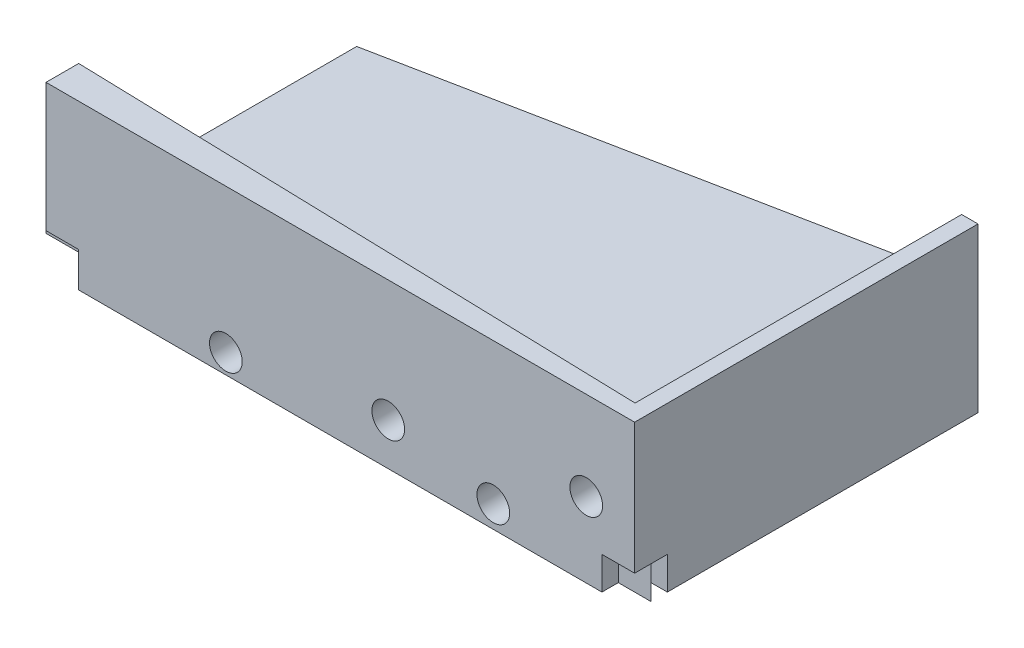
ISO-10303-21;
HEADER;
FILE_DESCRIPTION(('STEP AP214'),'2;1');
FILE_NAME('part.step','',(''),(''),'','','');
FILE_SCHEMA(('AUTOMOTIVE_DESIGN { 1 0 10303 214 1 1 1 1 }'));
ENDSEC;
DATA;
#1=APPLICATION_CONTEXT('core data for automotive mechanical design processes');
#2=APPLICATION_PROTOCOL_DEFINITION('international standard','automotive_design',2000,#1);
#3=PRODUCT_CONTEXT('',#1,'mechanical');
#4=PRODUCT('Part','Part','',(#3));
#5=PRODUCT_RELATED_PRODUCT_CATEGORY('part','',(#4));
#6=PRODUCT_DEFINITION_FORMATION('','',#4);
#7=PRODUCT_DEFINITION_CONTEXT('part definition',#1,'design');
#8=PRODUCT_DEFINITION('design','',#6,#7);
#9=PRODUCT_DEFINITION_SHAPE('','',#8);
#10=(LENGTH_UNIT() NAMED_UNIT(*) SI_UNIT(.MILLI.,.METRE.));
#11=(NAMED_UNIT(*) PLANE_ANGLE_UNIT() SI_UNIT($,.RADIAN.));
#12=(NAMED_UNIT(*) SI_UNIT($,.STERADIAN.) SOLID_ANGLE_UNIT());
#13=UNCERTAINTY_MEASURE_WITH_UNIT(LENGTH_MEASURE(1.E-05),#10,'distance_accuracy_value','');
#14=(GEOMETRIC_REPRESENTATION_CONTEXT(3) GLOBAL_UNCERTAINTY_ASSIGNED_CONTEXT((#13)) GLOBAL_UNIT_ASSIGNED_CONTEXT((#10,
#11,#12)) REPRESENTATION_CONTEXT('',''));
#15=CARTESIAN_POINT('',(0.,0.,0.));
#16=DIRECTION('',(0.,0.,1.));
#17=DIRECTION('',(1.,0.,0.));
#18=AXIS2_PLACEMENT_3D('',#15,#16,#17);
#19=CARTESIAN_POINT('',(-40.7960134047091,6.,200.));
#20=DIRECTION('',(0.,0.,-1.));
#21=DIRECTION('',(-1.,0.,0.));
#22=AXIS2_PLACEMENT_3D('',#19,#20,#21);
#23=CYLINDRICAL_SURFACE('',#22,3.);
#24=CARTESIAN_POINT('',(-40.7960134047091,6.,100.));
#25=DIRECTION('',(0.,0.,1.));
#26=DIRECTION('',(1.,0.,0.));
#27=AXIS2_PLACEMENT_3D('',#24,#25,#26);
#28=CIRCLE('',#27,3.);
#29=CARTESIAN_POINT('',(-37.7960134047091,6.,100.));
#30=VERTEX_POINT('',#29);
#31=EDGE_CURVE('E182',#30,#30,#28,.T.);
#32=ORIENTED_EDGE('',*,*,#31,.F.);
#33=EDGE_LOOP('',(#32));
#34=FACE_BOUND('',#33,.T.);
#35=CARTESIAN_POINT('',(-40.7960134047091,6.,190.));
#36=DIRECTION('',(0.,0.,1.));
#37=DIRECTION('',(1.,0.,0.));
#38=AXIS2_PLACEMENT_3D('',#35,#36,#37);
#39=CIRCLE('',#38,3.);
#40=CARTESIAN_POINT('',(-37.7960134047091,6.,190.));
#41=VERTEX_POINT('',#40);
#42=EDGE_CURVE('E184',#41,#41,#39,.T.);
#43=ORIENTED_EDGE('',*,*,#42,.T.);
#44=EDGE_LOOP('',(#43));
#45=FACE_BOUND('',#44,.T.);
#46=ADVANCED_FACE('F35',(#34,#45),#23,.F.);
#47=CARTESIAN_POINT('',(8.86154286614935,12.9010851063287,200.));
#48=DIRECTION('',(0.,0.,-1.));
#49=DIRECTION('',(-1.,0.,0.));
#50=AXIS2_PLACEMENT_3D('',#47,#48,#49);
#51=CYLINDRICAL_SURFACE('',#50,3.);
#52=CARTESIAN_POINT('',(8.86154286614935,12.9010851063287,100.));
#53=DIRECTION('',(0.,0.,1.));
#54=DIRECTION('',(1.,0.,0.));
#55=AXIS2_PLACEMENT_3D('',#52,#53,#54);
#56=CIRCLE('',#55,3.);
#57=CARTESIAN_POINT('',(11.8615428661494,12.9010851063287,100.));
#58=VERTEX_POINT('',#57);
#59=EDGE_CURVE('E418',#58,#58,#56,.T.);
#60=ORIENTED_EDGE('',*,*,#59,.F.);
#61=EDGE_LOOP('',(#60));
#62=FACE_BOUND('',#61,.T.);
#63=CARTESIAN_POINT('',(8.86154286614935,12.9010851063287,190.));
#64=DIRECTION('',(0.,0.,1.));
#65=DIRECTION('',(1.,0.,0.));
#66=AXIS2_PLACEMENT_3D('',#63,#64,#65);
#67=CIRCLE('',#66,3.);
#68=CARTESIAN_POINT('',(11.8615428661494,12.9010851063287,190.));
#69=VERTEX_POINT('',#68);
#70=EDGE_CURVE('E189',#69,#69,#67,.T.);
#71=ORIENTED_EDGE('',*,*,#70,.T.);
#72=EDGE_LOOP('',(#71));
#73=FACE_BOUND('',#72,.T.);
#74=ADVANCED_FACE('F365',(#62,#73),#51,.F.);
#75=CARTESIAN_POINT('',(40.9814690667464,6.77616521020496,200.));
#76=DIRECTION('',(0.,0.,-1.));
#77=DIRECTION('',(-1.,0.,0.));
#78=AXIS2_PLACEMENT_3D('',#75,#76,#77);
#79=CYLINDRICAL_SURFACE('',#78,3.00000000000001);
#80=CARTESIAN_POINT('',(40.9814690667464,6.77616521020496,100.));
#81=DIRECTION('',(0.,0.,1.));
#82=DIRECTION('',(1.,0.,0.));
#83=AXIS2_PLACEMENT_3D('',#80,#81,#82);
#84=CIRCLE('',#83,3.00000000000001);
#85=CARTESIAN_POINT('',(43.9814690667464,6.77616521020496,100.));
#86=VERTEX_POINT('',#85);
#87=EDGE_CURVE('E411',#86,#86,#84,.T.);
#88=ORIENTED_EDGE('',*,*,#87,.F.);
#89=EDGE_LOOP('',(#88));
#90=FACE_BOUND('',#89,.T.);
#91=CARTESIAN_POINT('',(40.9814690667464,6.77616521020496,190.));
#92=DIRECTION('',(0.,0.,1.));
#93=DIRECTION('',(1.,0.,0.));
#94=AXIS2_PLACEMENT_3D('',#91,#92,#93);
#95=CIRCLE('',#94,3.00000000000001);
#96=CARTESIAN_POINT('',(43.9814690667464,6.77616521020496,190.));
#97=VERTEX_POINT('',#96);
#98=EDGE_CURVE('E196',#97,#97,#95,.T.);
#99=ORIENTED_EDGE('',*,*,#98,.T.);
#100=EDGE_LOOP('',(#99));
#101=FACE_BOUND('',#100,.T.);
#102=ADVANCED_FACE('F371',(#90,#101),#79,.F.);
#103=CARTESIAN_POINT('',(69.4060048708337,22.9393971638675,200.));
#104=DIRECTION('',(0.,0.,-1.));
#105=DIRECTION('',(-1.,0.,0.));
#106=AXIS2_PLACEMENT_3D('',#103,#104,#105);
#107=CYLINDRICAL_SURFACE('',#106,3.00000000000001);
#108=CARTESIAN_POINT('',(69.4060048708337,22.9393971638675,100.));
#109=DIRECTION('',(0.,0.,1.));
#110=DIRECTION('',(1.,0.,0.));
#111=AXIS2_PLACEMENT_3D('',#108,#109,#110);
#112=CIRCLE('',#111,3.00000000000001);
#113=CARTESIAN_POINT('',(72.4060048708337,22.9393971638675,100.));
#114=VERTEX_POINT('',#113);
#115=EDGE_CURVE('E408',#114,#114,#112,.T.);
#116=ORIENTED_EDGE('',*,*,#115,.F.);
#117=EDGE_LOOP('',(#116));
#118=FACE_BOUND('',#117,.T.);
#119=CARTESIAN_POINT('',(69.4060048708337,22.9393971638675,190.));
#120=DIRECTION('',(0.,0.,1.));
#121=DIRECTION('',(1.,0.,0.));
#122=AXIS2_PLACEMENT_3D('',#119,#120,#121);
#123=CIRCLE('',#122,3.00000000000001);
#124=CARTESIAN_POINT('',(72.4060048708337,22.9393971638675,190.));
#125=VERTEX_POINT('',#124);
#126=EDGE_CURVE('E203',#125,#125,#123,.T.);
#127=ORIENTED_EDGE('',*,*,#126,.T.);
#128=EDGE_LOOP('',(#127));
#129=FACE_BOUND('',#128,.T.);
#130=ADVANCED_FACE('F380',(#118,#129),#107,.F.);
#131=CARTESIAN_POINT('',(-105.796013404709,2.,200.));
#132=DIRECTION('',(0.163567680624933,-0.986532114963816,0.));
#133=DIRECTION('',(0.986532114963816,0.163567680624933,0.));
#134=AXIS2_PLACEMENT_3D('',#131,#132,#133);
#135=PLANE('',#134);
#136=DIRECTION('',(0.,0.,-1.));
#137=VECTOR('',#136,1.);
#138=CARTESIAN_POINT('',(79.2039865952909,32.6731230100121,217.967909160371));
#139=LINE('',#138,#137);
#140=CARTESIAN_POINT('',(79.2039865952909,32.6731230100121,199.861111111111));
#141=VERTEX_POINT('',#140);
#142=CARTESIAN_POINT('',(79.2039865952909,32.6731230100121,100.));
#143=VERTEX_POINT('',#142);
#144=EDGE_CURVE('E177',#141,#143,#139,.T.);
#145=ORIENTED_EDGE('',*,*,#144,.T.);
#146=DIRECTION('',(-0.986532114963816,-0.163567680624933,0.));
#147=VECTOR('',#146,1.);
#148=CARTESIAN_POINT('',(-105.796013404709,2.,100.));
#149=LINE('',#148,#147);
#150=CARTESIAN_POINT('',(-105.796013404709,2.,100.));
#151=VERTEX_POINT('',#150);
#152=EDGE_CURVE('E49',#143,#151,#149,.T.);
#153=ORIENTED_EDGE('',*,*,#152,.T.);
#154=DIRECTION('',(0.,0.,-1.));
#155=VECTOR('',#154,1.);
#156=CARTESIAN_POINT('',(-105.796013404709,2.,200.));
#157=LINE('',#156,#155);
#158=CARTESIAN_POINT('',(-105.796013404709,2.,195.));
#159=VERTEX_POINT('',#158);
#160=EDGE_CURVE('E271',#159,#151,#157,.T.);
#161=ORIENTED_EDGE('',*,*,#160,.F.);
#162=DIRECTION('',(-0.986532114963816,-0.163567680624933,0.));
#163=VECTOR('',#162,1.);
#164=CARTESIAN_POINT('',(-105.796013404709,2.,195.));
#165=LINE('',#164,#163);
#166=CARTESIAN_POINT('',(-85.7960134047091,5.31601329837969,195.));
#167=VERTEX_POINT('',#166);
#168=EDGE_CURVE('E223',#167,#159,#165,.T.);
#169=ORIENTED_EDGE('',*,*,#168,.F.);
#170=DIRECTION('',(0.,0.,-1.));
#171=VECTOR('',#170,1.);
#172=CARTESIAN_POINT('',(-85.7960134047091,5.31601329837969,200.));
#173=LINE('',#172,#171);
#174=CARTESIAN_POINT('',(-85.7960134047091,5.31601329837969,195.277777777778));
#175=VERTEX_POINT('',#174);
#176=EDGE_CURVE('E226',#175,#167,#173,.T.);
#177=ORIENTED_EDGE('',*,*,#176,.F.);
#178=DIRECTION('',(-0.986161899831777,-0.163506298709877,-0.0273933861064383));
#179=VECTOR('',#178,1.);
#180=CARTESIAN_POINT('',(-105.653437860258,2.02363912007125,194.726182654013));
#181=LINE('',#180,#179);
#182=EDGE_CURVE('E248',#141,#175,#181,.T.);
#183=ORIENTED_EDGE('',*,*,#182,.F.);
#184=EDGE_LOOP('',(#145,#153,#161,#169,#177,#183));
#185=FACE_BOUND('',#184,.T.);
#186=ADVANCED_FACE('F384',(#185),#135,.F.);
#187=CARTESIAN_POINT('',(-105.796013404709,0.,200.));
#188=DIRECTION('',(1.,0.,0.));
#189=DIRECTION('',(0.,0.,-1.));
#190=AXIS2_PLACEMENT_3D('',#187,#188,#189);
#191=PLANE('',#190);
#192=ORIENTED_EDGE('',*,*,#160,.T.);
#193=DIRECTION('',(0.,-1.,0.));
#194=VECTOR('',#193,1.);
#195=CARTESIAN_POINT('',(-105.796013404709,0.,100.));
#196=LINE('',#195,#194);
#197=CARTESIAN_POINT('',(-105.796013404709,0.,100.));
#198=VERTEX_POINT('',#197);
#199=EDGE_CURVE('E404',#151,#198,#196,.T.);
#200=ORIENTED_EDGE('',*,*,#199,.T.);
#201=DIRECTION('',(0.,0.,-1.));
#202=VECTOR('',#201,1.);
#203=CARTESIAN_POINT('',(-105.796013404709,0.,200.));
#204=LINE('',#203,#202);
#205=CARTESIAN_POINT('',(-105.796013404709,0.,195.));
#206=VERTEX_POINT('',#205);
#207=EDGE_CURVE('E265',#206,#198,#204,.T.);
#208=ORIENTED_EDGE('',*,*,#207,.F.);
#209=DIRECTION('',(0.,1.,0.));
#210=VECTOR('',#209,1.);
#211=CARTESIAN_POINT('',(-105.796013404709,0.,195.));
#212=LINE('',#211,#210);
#213=EDGE_CURVE('E207',#206,#159,#212,.T.);
#214=ORIENTED_EDGE('',*,*,#213,.T.);
#215=EDGE_LOOP('',(#192,#200,#208,#214));
#216=FACE_BOUND('',#215,.T.);
#217=ADVANCED_FACE('F37',(#216),#191,.F.);
#218=CARTESIAN_POINT('',(-105.796013404709,0.,200.));
#219=DIRECTION('',(0.,1.,0.));
#220=DIRECTION('',(0.,0.,1.));
#221=AXIS2_PLACEMENT_3D('',#218,#219,#220);
#222=PLANE('',#221);
#223=ORIENTED_EDGE('',*,*,#207,.T.);
#224=DIRECTION('',(1.,0.,0.));
#225=VECTOR('',#224,1.);
#226=CARTESIAN_POINT('',(-105.796013404709,0.,100.));
#227=LINE('',#226,#225);
#228=CARTESIAN_POINT('',(84.2039865952909,0.,100.));
#229=VERTEX_POINT('',#228);
#230=EDGE_CURVE('E344',#198,#229,#227,.T.);
#231=ORIENTED_EDGE('',*,*,#230,.T.);
#232=DIRECTION('',(0.,0.,-1.));
#233=VECTOR('',#232,1.);
#234=CARTESIAN_POINT('',(84.2039865952909,0.,200.));
#235=LINE('',#234,#233);
#236=CARTESIAN_POINT('',(84.2039865952909,0.,195.));
#237=VERTEX_POINT('',#236);
#238=EDGE_CURVE('E268',#237,#229,#235,.T.);
#239=ORIENTED_EDGE('',*,*,#238,.F.);
#240=DIRECTION('',(1.,0.,0.));
#241=VECTOR('',#240,1.);
#242=CARTESIAN_POINT('',(74.2039865952909,0.,195.));
#243=LINE('',#242,#241);
#244=CARTESIAN_POINT('',(74.2039865952909,0.,195.));
#245=VERTEX_POINT('',#244);
#246=EDGE_CURVE('E289',#245,#237,#243,.T.);
#247=ORIENTED_EDGE('',*,*,#246,.F.);
#248=DIRECTION('',(0.,0.,-1.));
#249=VECTOR('',#248,1.);
#250=CARTESIAN_POINT('',(74.2039865952909,0.,205.));
#251=LINE('',#250,#249);
#252=CARTESIAN_POINT('',(74.2039865952909,0.,199.722222222222));
#253=VERTEX_POINT('',#252);
#254=EDGE_CURVE('E313',#253,#245,#251,.T.);
#255=ORIENTED_EDGE('',*,*,#254,.F.);
#256=DIRECTION('',(-0.999614420652718,0.,-0.0277670672403533));
#257=VECTOR('',#256,1.);
#258=CARTESIAN_POINT('',(-95.7960134047091,0.,195.));
#259=LINE('',#258,#257);
#260=CARTESIAN_POINT('',(84.2039865952909,0.,200.));
#261=VERTEX_POINT('',#260);
#262=EDGE_CURVE('E233',#261,#253,#259,.T.);
#263=ORIENTED_EDGE('',*,*,#262,.F.);
#264=DIRECTION('',(1.,0.,0.));
#265=VECTOR('',#264,1.);
#266=CARTESIAN_POINT('',(84.2039865952909,0.,200.));
#267=LINE('',#266,#265);
#268=CARTESIAN_POINT('',(74.2039865952909,0.,200.));
#269=VERTEX_POINT('',#268);
#270=EDGE_CURVE('E231',#269,#261,#267,.T.);
#271=ORIENTED_EDGE('',*,*,#270,.F.);
#272=CARTESIAN_POINT('',(74.2039865952909,0.,205.));
#273=VERTEX_POINT('',#272);
#274=EDGE_CURVE('E311',#273,#269,#251,.T.);
#275=ORIENTED_EDGE('',*,*,#274,.F.);
#276=DIRECTION('',(1.,0.,0.));
#277=VECTOR('',#276,1.);
#278=CARTESIAN_POINT('',(-95.7960134047091,0.,205.));
#279=LINE('',#278,#277);
#280=CARTESIAN_POINT('',(-85.7960134047091,0.,205.));
#281=VERTEX_POINT('',#280);
#282=EDGE_CURVE('E274',#281,#273,#279,.T.);
#283=ORIENTED_EDGE('',*,*,#282,.F.);
#284=DIRECTION('',(0.,0.,1.));
#285=VECTOR('',#284,1.);
#286=CARTESIAN_POINT('',(-85.7960134047091,0.,195.));
#287=LINE('',#286,#285);
#288=CARTESIAN_POINT('',(-85.7960134047091,0.,195.));
#289=VERTEX_POINT('',#288);
#290=EDGE_CURVE('E216',#289,#281,#287,.T.);
#291=ORIENTED_EDGE('',*,*,#290,.F.);
#292=DIRECTION('',(-1.,0.,0.));
#293=VECTOR('',#292,1.);
#294=CARTESIAN_POINT('',(-105.796013404709,0.,195.));
#295=LINE('',#294,#293);
#296=EDGE_CURVE('E210',#289,#206,#295,.T.);
#297=ORIENTED_EDGE('',*,*,#296,.T.);
#298=EDGE_LOOP('',(#223,#231,#239,#247,#255,#263,#271,#275,#283,#291,#297));
#299=FACE_BOUND('',#298,.T.);
#300=ADVANCED_FACE('F325',(#299),#222,.F.);
#301=CARTESIAN_POINT('',(-95.7960134047091,0.,0.));
#302=DIRECTION('',(1.,0.,0.));
#303=DIRECTION('',(0.,0.,-1.));
#304=AXIS2_PLACEMENT_3D('',#301,#302,#303);
#305=PLANE('',#304);
#306=DIRECTION('',(0.,0.,-1.));
#307=VECTOR('',#306,1.);
#308=CARTESIAN_POINT('',(-95.7960134047091,10.7198341627884,0.));
#309=LINE('',#308,#307);
#310=CARTESIAN_POINT('',(-95.7960134047091,10.7198341627884,205.));
#311=VERTEX_POINT('',#310);
#312=CARTESIAN_POINT('',(-95.7960134047091,10.7198341627884,195.));
#313=VERTEX_POINT('',#312);
#314=EDGE_CURVE('E228',#311,#313,#309,.T.);
#315=ORIENTED_EDGE('',*,*,#314,.F.);
#316=DIRECTION('',(0.,-1.,0.));
#317=VECTOR('',#316,1.);
#318=CARTESIAN_POINT('',(-95.7960134047091,0.,205.));
#319=LINE('',#318,#317);
#320=CARTESIAN_POINT('',(-95.7960134047091,50.,205.));
#321=VERTEX_POINT('',#320);
#322=EDGE_CURVE('E277',#321,#311,#319,.T.);
#323=ORIENTED_EDGE('',*,*,#322,.F.);
#324=DIRECTION('',(0.,0.,1.));
#325=VECTOR('',#324,1.);
#326=CARTESIAN_POINT('',(-95.7960134047091,50.,200.));
#327=LINE('',#326,#325);
#328=CARTESIAN_POINT('',(-95.7960134047091,50.,195.));
#329=VERTEX_POINT('',#328);
#330=EDGE_CURVE('E282',#329,#321,#327,.T.);
#331=ORIENTED_EDGE('',*,*,#330,.F.);
#332=DIRECTION('',(0.,1.,0.));
#333=VECTOR('',#332,1.);
#334=CARTESIAN_POINT('',(-95.7960134047091,-180.069431053691,195.));
#335=LINE('',#334,#333);
#336=EDGE_CURVE('E239',#313,#329,#335,.T.);
#337=ORIENTED_EDGE('',*,*,#336,.F.);
#338=EDGE_LOOP('',(#315,#323,#331,#337));
#339=FACE_BOUND('',#338,.T.);
#340=ADVANCED_FACE('F391',(#339),#305,.F.);
#341=CARTESIAN_POINT('',(-95.7960134047091,0.,205.));
#342=DIRECTION('',(0.,0.,1.));
#343=DIRECTION('',(1.,0.,0.));
#344=AXIS2_PLACEMENT_3D('',#341,#342,#343);
#345=PLANE('',#344);
#346=CARTESIAN_POINT('',(-40.7960134047091,6.,205.));
#347=DIRECTION('',(0.,0.,-1.));
#348=DIRECTION('',(-1.,0.,0.));
#349=AXIS2_PLACEMENT_3D('',#346,#347,#348);
#350=CIRCLE('',#349,5.);
#351=CARTESIAN_POINT('',(-45.7960134047091,6.,205.));
#352=VERTEX_POINT('',#351);
#353=EDGE_CURVE('E172',#352,#352,#350,.T.);
#354=ORIENTED_EDGE('',*,*,#353,.T.);
#355=EDGE_LOOP('',(#354));
#356=FACE_BOUND('',#355,.T.);
#357=CARTESIAN_POINT('',(8.86154286614935,12.9010851063287,205.));
#358=DIRECTION('',(0.,0.,-1.));
#359=DIRECTION('',(-1.,0.,0.));
#360=AXIS2_PLACEMENT_3D('',#357,#358,#359);
#361=CIRCLE('',#360,5.);
#362=CARTESIAN_POINT('',(3.86154286614935,12.9010851063287,205.));
#363=VERTEX_POINT('',#362);
#364=EDGE_CURVE('E190',#363,#363,#361,.T.);
#365=ORIENTED_EDGE('',*,*,#364,.T.);
#366=EDGE_LOOP('',(#365));
#367=FACE_BOUND('',#366,.T.);
#368=CARTESIAN_POINT('',(40.9814690667464,6.77616521020496,205.));
#369=DIRECTION('',(0.,0.,-1.));
#370=DIRECTION('',(-1.,0.,0.));
#371=AXIS2_PLACEMENT_3D('',#368,#369,#370);
#372=CIRCLE('',#371,5.);
#373=CARTESIAN_POINT('',(35.9814690667464,6.77616521020496,205.));
#374=VERTEX_POINT('',#373);
#375=EDGE_CURVE('E197',#374,#374,#372,.T.);
#376=ORIENTED_EDGE('',*,*,#375,.T.);
#377=EDGE_LOOP('',(#376));
#378=FACE_BOUND('',#377,.T.);
#379=CARTESIAN_POINT('',(69.4060048708337,22.9393971638675,205.));
#380=DIRECTION('',(0.,0.,-1.));
#381=DIRECTION('',(-1.,0.,0.));
#382=AXIS2_PLACEMENT_3D('',#379,#380,#381);
#383=CIRCLE('',#382,5.);
#384=CARTESIAN_POINT('',(64.4060048708336,22.9393971638675,205.));
#385=VERTEX_POINT('',#384);
#386=EDGE_CURVE('E204',#385,#385,#383,.T.);
#387=ORIENTED_EDGE('',*,*,#386,.T.);
#388=EDGE_LOOP('',(#387));
#389=FACE_BOUND('',#388,.T.);
#390=ORIENTED_EDGE('',*,*,#322,.T.);
#391=DIRECTION('',(1.,0.,0.));
#392=VECTOR('',#391,1.);
#393=CARTESIAN_POINT('',(-105.796013404709,10.7198341627884,205.));
#394=LINE('',#393,#392);
#395=CARTESIAN_POINT('',(-85.7960134047091,10.7198341627884,205.));
#396=VERTEX_POINT('',#395);
#397=EDGE_CURVE('E211',#311,#396,#394,.T.);
#398=ORIENTED_EDGE('',*,*,#397,.T.);
#399=DIRECTION('',(0.,-1.,0.));
#400=VECTOR('',#399,1.);
#401=CARTESIAN_POINT('',(-85.7960134047091,0.,205.));
#402=LINE('',#401,#400);
#403=EDGE_CURVE('E217',#396,#281,#402,.T.);
#404=ORIENTED_EDGE('',*,*,#403,.T.);
#405=ORIENTED_EDGE('',*,*,#282,.T.);
#406=DIRECTION('',(0.,-1.,0.));
#407=VECTOR('',#406,1.);
#408=CARTESIAN_POINT('',(74.2039865952909,0.,205.));
#409=LINE('',#408,#407);
#410=CARTESIAN_POINT('',(74.2039865952909,10.,205.));
#411=VERTEX_POINT('',#410);
#412=EDGE_CURVE('E299',#411,#273,#409,.T.);
#413=ORIENTED_EDGE('',*,*,#412,.F.);
#414=DIRECTION('',(1.,0.,0.));
#415=VECTOR('',#414,1.);
#416=CARTESIAN_POINT('',(74.2039865952909,10.,205.));
#417=LINE('',#416,#415);
#418=CARTESIAN_POINT('',(84.2039865952909,10.,205.));
#419=VERTEX_POINT('',#418);
#420=EDGE_CURVE('E284',#411,#419,#417,.T.);
#421=ORIENTED_EDGE('',*,*,#420,.T.);
#422=DIRECTION('',(0.,-1.,0.));
#423=VECTOR('',#422,1.);
#424=CARTESIAN_POINT('',(84.2039865952909,0.,205.));
#425=LINE('',#424,#423);
#426=CARTESIAN_POINT('',(84.2039865952909,50.,205.));
#427=VERTEX_POINT('',#426);
#428=EDGE_CURVE('E279',#427,#419,#425,.T.);
#429=ORIENTED_EDGE('',*,*,#428,.F.);
#430=DIRECTION('',(1.,0.,0.));
#431=VECTOR('',#430,1.);
#432=CARTESIAN_POINT('',(-95.7960134047091,50.,205.));
#433=LINE('',#432,#431);
#434=EDGE_CURVE('E275',#321,#427,#433,.T.);
#435=ORIENTED_EDGE('',*,*,#434,.F.);
#436=EDGE_LOOP('',(#390,#398,#404,#405,#413,#421,#429,#435));
#437=FACE_BOUND('',#436,.T.);
#438=ADVANCED_FACE('F354',(#356,#367,#378,#389,#437),#345,.T.);
#439=CARTESIAN_POINT('',(-95.7960134047091,-180.069431053691,195.));
#440=DIRECTION('',(-0.0277670672403533,0.,0.999614420652718));
#441=DIRECTION('',(0.999614420652718,0.,0.0277670672403533));
#442=AXIS2_PLACEMENT_3D('',#439,#440,#441);
#443=PLANE('',#442);
#444=DIRECTION('',(0.999614420652718,0.,0.0277670672403533));
#445=VECTOR('',#444,1.);
#446=CARTESIAN_POINT('',(-95.7960134047091,50.,195.));
#447=LINE('',#446,#445);
#448=CARTESIAN_POINT('',(79.2039865952909,50.,199.861111111111));
#449=VERTEX_POINT('',#448);
#450=EDGE_CURVE('E230',#329,#449,#447,.T.);
#451=ORIENTED_EDGE('',*,*,#450,.T.);
#452=DIRECTION('',(0.,1.,0.));
#453=VECTOR('',#452,1.);
#454=CARTESIAN_POINT('',(79.2039865952909,32.6731230100121,199.861111111111));
#455=LINE('',#454,#453);
#456=EDGE_CURVE('E170',#141,#449,#455,.T.);
#457=ORIENTED_EDGE('',*,*,#456,.F.);
#458=ORIENTED_EDGE('',*,*,#182,.T.);
#459=DIRECTION('',(0.,-1.,0.));
#460=VECTOR('',#459,1.);
#461=CARTESIAN_POINT('',(-85.7960134047091,-180.069431053691,195.277777777778));
#462=LINE('',#461,#460);
#463=CARTESIAN_POINT('',(-85.7960134047091,10.7198341627884,195.277777777778));
#464=VERTEX_POINT('',#463);
#465=EDGE_CURVE('E263',#464,#175,#462,.T.);
#466=ORIENTED_EDGE('',*,*,#465,.F.);
#467=DIRECTION('',(0.999614420652718,0.,0.0277670672403533));
#468=VECTOR('',#467,1.);
#469=CARTESIAN_POINT('',(-95.7960134047091,10.7198341627884,195.));
#470=LINE('',#469,#468);
#471=EDGE_CURVE('E43',#313,#464,#470,.T.);
#472=ORIENTED_EDGE('',*,*,#471,.F.);
#473=ORIENTED_EDGE('',*,*,#336,.T.);
#474=EDGE_LOOP('',(#451,#457,#458,#466,#472,#473));
#475=FACE_BOUND('',#474,.T.);
#476=ADVANCED_FACE('F448',(#475),#443,.F.);
#477=CARTESIAN_POINT('',(74.2039865952909,10.,205.));
#478=DIRECTION('',(0.,1.,0.));
#479=DIRECTION('',(0.,0.,1.));
#480=AXIS2_PLACEMENT_3D('',#477,#478,#479);
#481=PLANE('',#480);
#482=DIRECTION('',(-1.,0.,0.));
#483=VECTOR('',#482,1.);
#484=CARTESIAN_POINT('',(74.2039865952909,10.,200.));
#485=LINE('',#484,#483);
#486=CARTESIAN_POINT('',(84.2039865952909,10.,200.));
#487=VERTEX_POINT('',#486);
#488=CARTESIAN_POINT('',(74.2039865952909,10.,200.));
#489=VERTEX_POINT('',#488);
#490=EDGE_CURVE('E304',#487,#489,#485,.T.);
#491=ORIENTED_EDGE('',*,*,#490,.F.);
#492=DIRECTION('',(0.,0.,1.));
#493=VECTOR('',#492,1.);
#494=CARTESIAN_POINT('',(84.2039865952909,10.,205.));
#495=LINE('',#494,#493);
#496=EDGE_CURVE('E300',#487,#419,#495,.T.);
#497=ORIENTED_EDGE('',*,*,#496,.T.);
#498=ORIENTED_EDGE('',*,*,#420,.F.);
#499=DIRECTION('',(0.,0.,1.));
#500=VECTOR('',#499,1.);
#501=CARTESIAN_POINT('',(74.2039865952909,10.,205.));
#502=LINE('',#501,#500);
#503=EDGE_CURVE('E307',#489,#411,#502,.T.);
#504=ORIENTED_EDGE('',*,*,#503,.F.);
#505=EDGE_LOOP('',(#491,#497,#498,#504));
#506=FACE_BOUND('',#505,.T.);
#507=ADVANCED_FACE('F351',(#506),#481,.F.);
#508=DIRECTION('',(0.999614420652718,0.,0.0277670672403533));
#509=VECTOR('',#508,1.);
#510=CARTESIAN_POINT('',(74.3504784996857,10.,199.726291441789));
#511=LINE('',#510,#509);
#512=CARTESIAN_POINT('',(74.2039865952909,10.,199.722222222222));
#513=VERTEX_POINT('',#512);
#514=EDGE_CURVE('E245',#513,#487,#511,.T.);
#515=ORIENTED_EDGE('',*,*,#514,.F.);
#516=CARTESIAN_POINT('',(74.2039865952909,10.,195.));
#517=VERTEX_POINT('',#516);
#518=EDGE_CURVE('E292',#517,#513,#502,.T.);
#519=ORIENTED_EDGE('',*,*,#518,.F.);
#520=DIRECTION('',(1.,0.,0.));
#521=VECTOR('',#520,1.);
#522=CARTESIAN_POINT('',(74.2039865952909,10.,195.));
#523=LINE('',#522,#521);
#524=CARTESIAN_POINT('',(84.2039865952909,10.,195.));
#525=VERTEX_POINT('',#524);
#526=EDGE_CURVE('E291',#517,#525,#523,.T.);
#527=ORIENTED_EDGE('',*,*,#526,.T.);
#528=EDGE_CURVE('E296',#525,#487,#495,.T.);
#529=ORIENTED_EDGE('',*,*,#528,.T.);
#530=EDGE_LOOP('',(#515,#519,#527,#529));
#531=FACE_BOUND('',#530,.T.);
#532=ADVANCED_FACE('F334',(#531),#481,.F.);
#533=CARTESIAN_POINT('',(74.2039865952909,0.,0.));
#534=DIRECTION('',(-1.,0.,0.));
#535=DIRECTION('',(0.,0.,1.));
#536=AXIS2_PLACEMENT_3D('',#533,#534,#535);
#537=PLANE('',#536);
#538=DIRECTION('',(0.,-1.,0.));
#539=VECTOR('',#538,1.);
#540=CARTESIAN_POINT('',(74.2039865952909,0.,200.));
#541=LINE('',#540,#539);
#542=EDGE_CURVE('E251',#489,#269,#541,.T.);
#543=ORIENTED_EDGE('',*,*,#542,.F.);
#544=ORIENTED_EDGE('',*,*,#503,.T.);
#545=ORIENTED_EDGE('',*,*,#412,.T.);
#546=ORIENTED_EDGE('',*,*,#274,.T.);
#547=EDGE_LOOP('',(#543,#544,#545,#546));
#548=FACE_BOUND('',#547,.T.);
#549=ADVANCED_FACE('F355',(#548),#537,.F.);
#550=DIRECTION('',(0.,1.,0.));
#551=VECTOR('',#550,1.);
#552=CARTESIAN_POINT('',(74.2039865952909,0.,199.722222222222));
#553=LINE('',#552,#551);
#554=EDGE_CURVE('E237',#253,#513,#553,.T.);
#555=ORIENTED_EDGE('',*,*,#554,.F.);
#556=ORIENTED_EDGE('',*,*,#254,.T.);
#557=DIRECTION('',(0.,1.,0.));
#558=VECTOR('',#557,1.);
#559=CARTESIAN_POINT('',(74.2039865952909,0.,195.));
#560=LINE('',#559,#558);
#561=EDGE_CURVE('E308',#245,#517,#560,.T.);
#562=ORIENTED_EDGE('',*,*,#561,.T.);
#563=ORIENTED_EDGE('',*,*,#518,.T.);
#564=EDGE_LOOP('',(#555,#556,#562,#563));
#565=FACE_BOUND('',#564,.T.);
#566=ADVANCED_FACE('F337',(#565),#537,.F.);
#567=CARTESIAN_POINT('',(84.2039865952909,0.,200.));
#568=DIRECTION('',(-1.,0.,0.));
#569=DIRECTION('',(0.,0.,1.));
#570=AXIS2_PLACEMENT_3D('',#567,#568,#569);
#571=PLANE('',#570);
#572=ORIENTED_EDGE('',*,*,#238,.T.);
#573=DIRECTION('',(0.,1.,0.));
#574=VECTOR('',#573,1.);
#575=CARTESIAN_POINT('',(84.2039865952909,0.,100.));
#576=LINE('',#575,#574);
#577=CARTESIAN_POINT('',(84.2039865952909,50.,100.));
#578=VERTEX_POINT('',#577);
#579=EDGE_CURVE('E166',#229,#578,#576,.T.);
#580=ORIENTED_EDGE('',*,*,#579,.T.);
#581=DIRECTION('',(0.,0.,1.));
#582=VECTOR('',#581,1.);
#583=CARTESIAN_POINT('',(84.2039865952909,50.,200.));
#584=LINE('',#583,#582);
#585=EDGE_CURVE('E165',#578,#427,#584,.T.);
#586=ORIENTED_EDGE('',*,*,#585,.T.);
#587=ORIENTED_EDGE('',*,*,#428,.T.);
#588=ORIENTED_EDGE('',*,*,#496,.F.);
#589=ORIENTED_EDGE('',*,*,#528,.F.);
#590=DIRECTION('',(0.,1.,0.));
#591=VECTOR('',#590,1.);
#592=CARTESIAN_POINT('',(84.2039865952909,0.,195.));
#593=LINE('',#592,#591);
#594=EDGE_CURVE('E301',#237,#525,#593,.T.);
#595=ORIENTED_EDGE('',*,*,#594,.F.);
#596=EDGE_LOOP('',(#572,#580,#586,#587,#588,#589,#595));
#597=FACE_BOUND('',#596,.T.);
#598=ADVANCED_FACE('F346',(#597),#571,.F.);
#599=CARTESIAN_POINT('',(-95.7960134047091,50.,200.));
#600=DIRECTION('',(0.,1.,0.));
#601=DIRECTION('',(0.,0.,1.));
#602=AXIS2_PLACEMENT_3D('',#599,#600,#601);
#603=PLANE('',#602);
#604=DIRECTION('',(1.,0.,0.));
#605=VECTOR('',#604,1.);
#606=CARTESIAN_POINT('',(-95.7960134047091,50.,100.));
#607=LINE('',#606,#605);
#608=CARTESIAN_POINT('',(79.2039865952909,50.,100.));
#609=VERTEX_POINT('',#608);
#610=EDGE_CURVE('E153',#609,#578,#607,.T.);
#611=ORIENTED_EDGE('',*,*,#610,.F.);
#612=DIRECTION('',(0.,0.,-1.));
#613=VECTOR('',#612,1.);
#614=CARTESIAN_POINT('',(79.2039865952909,50.,217.967909160371));
#615=LINE('',#614,#613);
#616=EDGE_CURVE('E162',#449,#609,#615,.T.);
#617=ORIENTED_EDGE('',*,*,#616,.F.);
#618=ORIENTED_EDGE('',*,*,#450,.F.);
#619=ORIENTED_EDGE('',*,*,#330,.T.);
#620=ORIENTED_EDGE('',*,*,#434,.T.);
#621=ORIENTED_EDGE('',*,*,#585,.F.);
#622=EDGE_LOOP('',(#611,#617,#618,#619,#620,#621));
#623=FACE_BOUND('',#622,.T.);
#624=ADVANCED_FACE('F160',(#623),#603,.T.);
#625=CARTESIAN_POINT('',(74.2039865952909,0.,195.));
#626=DIRECTION('',(0.,0.,-1.));
#627=DIRECTION('',(-1.,0.,0.));
#628=AXIS2_PLACEMENT_3D('',#625,#626,#627);
#629=PLANE('',#628);
#630=ORIENTED_EDGE('',*,*,#594,.T.);
#631=ORIENTED_EDGE('',*,*,#526,.F.);
#632=ORIENTED_EDGE('',*,*,#561,.F.);
#633=ORIENTED_EDGE('',*,*,#246,.T.);
#634=EDGE_LOOP('',(#630,#631,#632,#633));
#635=FACE_BOUND('',#634,.T.);
#636=ADVANCED_FACE('F340',(#635),#629,.F.);
#637=ORIENTED_EDGE('',*,*,#554,.T.);
#638=ORIENTED_EDGE('',*,*,#514,.T.);
#639=DIRECTION('',(0.,1.,0.));
#640=VECTOR('',#639,1.);
#641=CARTESIAN_POINT('',(84.2039865952909,-180.069431053691,200.));
#642=LINE('',#641,#640);
#643=EDGE_CURVE('E234',#261,#487,#642,.T.);
#644=ORIENTED_EDGE('',*,*,#643,.F.);
#645=ORIENTED_EDGE('',*,*,#262,.T.);
#646=EDGE_LOOP('',(#637,#638,#644,#645));
#647=FACE_BOUND('',#646,.T.);
#648=ADVANCED_FACE('F331',(#647),#443,.F.);
#649=CARTESIAN_POINT('',(84.2039865952909,-180.069431053691,200.));
#650=DIRECTION('',(0.,0.,-1.));
#651=DIRECTION('',(-1.,0.,0.));
#652=AXIS2_PLACEMENT_3D('',#649,#650,#651);
#653=PLANE('',#652);
#654=ORIENTED_EDGE('',*,*,#643,.T.);
#655=ORIENTED_EDGE('',*,*,#490,.T.);
#656=ORIENTED_EDGE('',*,*,#542,.T.);
#657=ORIENTED_EDGE('',*,*,#270,.T.);
#658=EDGE_LOOP('',(#654,#655,#656,#657));
#659=FACE_BOUND('',#658,.T.);
#660=ADVANCED_FACE('F319',(#659),#653,.F.);
#661=CARTESIAN_POINT('',(-105.796013404709,10.7198341627884,195.));
#662=DIRECTION('',(0.,-1.,0.));
#663=DIRECTION('',(0.,0.,-1.));
#664=AXIS2_PLACEMENT_3D('',#661,#662,#663);
#665=PLANE('',#664);
#666=ORIENTED_EDGE('',*,*,#314,.T.);
#667=ORIENTED_EDGE('',*,*,#471,.T.);
#668=DIRECTION('',(0.,0.,1.));
#669=VECTOR('',#668,1.);
#670=CARTESIAN_POINT('',(-85.7960134047091,10.7198341627884,195.));
#671=LINE('',#670,#669);
#672=EDGE_CURVE('E57',#464,#396,#671,.T.);
#673=ORIENTED_EDGE('',*,*,#672,.T.);
#674=ORIENTED_EDGE('',*,*,#397,.F.);
#675=EDGE_LOOP('',(#666,#667,#673,#674));
#676=FACE_BOUND('',#675,.T.);
#677=ADVANCED_FACE('F500',(#676),#665,.T.);
#678=CARTESIAN_POINT('',(-85.7960134047091,0.,195.));
#679=DIRECTION('',(-1.,0.,0.));
#680=DIRECTION('',(0.,0.,1.));
#681=AXIS2_PLACEMENT_3D('',#678,#679,#680);
#682=PLANE('',#681);
#683=ORIENTED_EDGE('',*,*,#176,.T.);
#684=DIRECTION('',(0.,-1.,0.));
#685=VECTOR('',#684,1.);
#686=CARTESIAN_POINT('',(-85.7960134047091,0.,195.));
#687=LINE('',#686,#685);
#688=EDGE_CURVE('E214',#167,#289,#687,.T.);
#689=ORIENTED_EDGE('',*,*,#688,.T.);
#690=ORIENTED_EDGE('',*,*,#290,.T.);
#691=ORIENTED_EDGE('',*,*,#403,.F.);
#692=ORIENTED_EDGE('',*,*,#672,.F.);
#693=ORIENTED_EDGE('',*,*,#465,.T.);
#694=EDGE_LOOP('',(#683,#689,#690,#691,#692,#693));
#695=FACE_BOUND('',#694,.T.);
#696=ADVANCED_FACE('F510',(#695),#682,.T.);
#697=CARTESIAN_POINT('',(0.,0.,195.));
#698=DIRECTION('',(0.,0.,1.));
#699=DIRECTION('',(-1.,0.,0.));
#700=AXIS2_PLACEMENT_3D('',#697,#698,#699);
#701=PLANE('',#700);
#702=ORIENTED_EDGE('',*,*,#168,.T.);
#703=ORIENTED_EDGE('',*,*,#213,.F.);
#704=ORIENTED_EDGE('',*,*,#296,.F.);
#705=ORIENTED_EDGE('',*,*,#688,.F.);
#706=EDGE_LOOP('',(#702,#703,#704,#705));
#707=FACE_BOUND('',#706,.T.);
#708=ADVANCED_FACE('F443',(#707),#701,.T.);
#709=CARTESIAN_POINT('',(69.4060048708337,22.9393971638675,190.));
#710=DIRECTION('',(0.,0.,1.));
#711=DIRECTION('',(1.,0.,0.));
#712=AXIS2_PLACEMENT_3D('',#709,#710,#711);
#713=CYLINDRICAL_SURFACE('',#712,5.);
#714=CARTESIAN_POINT('',(69.4060048708337,22.9393971638675,190.));
#715=DIRECTION('',(0.,0.,-1.));
#716=DIRECTION('',(-1.,0.,0.));
#717=AXIS2_PLACEMENT_3D('',#714,#715,#716);
#718=CIRCLE('',#717,5.);
#719=CARTESIAN_POINT('',(64.4060048708336,22.9393971638675,190.));
#720=VERTEX_POINT('',#719);
#721=EDGE_CURVE('E200',#720,#720,#718,.T.);
#722=ORIENTED_EDGE('',*,*,#721,.T.);
#723=EDGE_LOOP('',(#722));
#724=FACE_BOUND('',#723,.T.);
#725=ORIENTED_EDGE('',*,*,#386,.F.);
#726=EDGE_LOOP('',(#725));
#727=FACE_BOUND('',#726,.T.);
#728=ADVANCED_FACE('F437',(#724,#727),#713,.F.);
#729=CARTESIAN_POINT('',(69.4060048708337,22.9393971638675,190.));
#730=DIRECTION('',(0.,0.,1.));
#731=DIRECTION('',(-1.,0.,0.));
#732=AXIS2_PLACEMENT_3D('',#729,#730,#731);
#733=PLANE('',#732);
#734=ORIENTED_EDGE('',*,*,#126,.F.);
#735=EDGE_LOOP('',(#734));
#736=FACE_BOUND('',#735,.T.);
#737=ORIENTED_EDGE('',*,*,#721,.F.);
#738=EDGE_LOOP('',(#737));
#739=FACE_BOUND('',#738,.T.);
#740=ADVANCED_FACE('F433',(#736,#739),#733,.T.);
#741=CARTESIAN_POINT('',(40.9814690667464,6.77616521020496,190.));
#742=DIRECTION('',(0.,0.,1.));
#743=DIRECTION('',(1.,0.,0.));
#744=AXIS2_PLACEMENT_3D('',#741,#742,#743);
#745=CYLINDRICAL_SURFACE('',#744,5.);
#746=CARTESIAN_POINT('',(40.9814690667464,6.77616521020496,190.));
#747=DIRECTION('',(0.,0.,-1.));
#748=DIRECTION('',(-1.,0.,0.));
#749=AXIS2_PLACEMENT_3D('',#746,#747,#748);
#750=CIRCLE('',#749,5.);
#751=CARTESIAN_POINT('',(35.9814690667464,6.77616521020496,190.));
#752=VERTEX_POINT('',#751);
#753=EDGE_CURVE('E193',#752,#752,#750,.T.);
#754=ORIENTED_EDGE('',*,*,#753,.T.);
#755=EDGE_LOOP('',(#754));
#756=FACE_BOUND('',#755,.T.);
#757=ORIENTED_EDGE('',*,*,#375,.F.);
#758=EDGE_LOOP('',(#757));
#759=FACE_BOUND('',#758,.T.);
#760=ADVANCED_FACE('F436',(#756,#759),#745,.F.);
#761=CARTESIAN_POINT('',(40.9814690667464,6.77616521020496,190.));
#762=DIRECTION('',(0.,0.,1.));
#763=DIRECTION('',(-1.,0.,0.));
#764=AXIS2_PLACEMENT_3D('',#761,#762,#763);
#765=PLANE('',#764);
#766=ORIENTED_EDGE('',*,*,#98,.F.);
#767=EDGE_LOOP('',(#766));
#768=FACE_BOUND('',#767,.T.);
#769=ORIENTED_EDGE('',*,*,#753,.F.);
#770=EDGE_LOOP('',(#769));
#771=FACE_BOUND('',#770,.T.);
#772=ADVANCED_FACE('F552',(#768,#771),#765,.T.);
#773=CARTESIAN_POINT('',(8.86154286614935,12.9010851063287,190.));
#774=DIRECTION('',(0.,0.,1.));
#775=DIRECTION('',(1.,0.,0.));
#776=AXIS2_PLACEMENT_3D('',#773,#774,#775);
#777=CYLINDRICAL_SURFACE('',#776,5.);
#778=CARTESIAN_POINT('',(8.86154286614935,12.9010851063287,190.));
#779=DIRECTION('',(0.,0.,-1.));
#780=DIRECTION('',(-1.,0.,0.));
#781=AXIS2_PLACEMENT_3D('',#778,#779,#780);
#782=CIRCLE('',#781,5.);
#783=CARTESIAN_POINT('',(3.86154286614935,12.9010851063287,190.));
#784=VERTEX_POINT('',#783);
#785=EDGE_CURVE('E186',#784,#784,#782,.T.);
#786=ORIENTED_EDGE('',*,*,#785,.T.);
#787=EDGE_LOOP('',(#786));
#788=FACE_BOUND('',#787,.T.);
#789=ORIENTED_EDGE('',*,*,#364,.F.);
#790=EDGE_LOOP('',(#789));
#791=FACE_BOUND('',#790,.T.);
#792=ADVANCED_FACE('F562',(#788,#791),#777,.F.);
#793=CARTESIAN_POINT('',(8.86154286614935,12.9010851063287,190.));
#794=DIRECTION('',(0.,0.,1.));
#795=DIRECTION('',(-1.,0.,0.));
#796=AXIS2_PLACEMENT_3D('',#793,#794,#795);
#797=PLANE('',#796);
#798=ORIENTED_EDGE('',*,*,#70,.F.);
#799=EDGE_LOOP('',(#798));
#800=FACE_BOUND('',#799,.T.);
#801=ORIENTED_EDGE('',*,*,#785,.F.);
#802=EDGE_LOOP('',(#801));
#803=FACE_BOUND('',#802,.T.);
#804=ADVANCED_FACE('F572',(#800,#803),#797,.T.);
#805=CARTESIAN_POINT('',(-40.7960134047091,6.,190.));
#806=DIRECTION('',(0.,0.,1.));
#807=DIRECTION('',(1.,0.,0.));
#808=AXIS2_PLACEMENT_3D('',#805,#806,#807);
#809=CYLINDRICAL_SURFACE('',#808,5.);
#810=CARTESIAN_POINT('',(-40.7960134047091,6.,190.));
#811=DIRECTION('',(0.,0.,-1.));
#812=DIRECTION('',(-1.,0.,0.));
#813=AXIS2_PLACEMENT_3D('',#810,#811,#812);
#814=CIRCLE('',#813,5.);
#815=CARTESIAN_POINT('',(-45.7960134047091,6.,190.));
#816=VERTEX_POINT('',#815);
#817=EDGE_CURVE('E175',#816,#816,#814,.T.);
#818=ORIENTED_EDGE('',*,*,#817,.T.);
#819=EDGE_LOOP('',(#818));
#820=FACE_BOUND('',#819,.T.);
#821=ORIENTED_EDGE('',*,*,#353,.F.);
#822=EDGE_LOOP('',(#821));
#823=FACE_BOUND('',#822,.T.);
#824=ADVANCED_FACE('F582',(#820,#823),#809,.F.);
#825=CARTESIAN_POINT('',(-40.7960134047091,6.,190.));
#826=DIRECTION('',(0.,0.,1.));
#827=DIRECTION('',(-1.,0.,0.));
#828=AXIS2_PLACEMENT_3D('',#825,#826,#827);
#829=PLANE('',#828);
#830=ORIENTED_EDGE('',*,*,#42,.F.);
#831=EDGE_LOOP('',(#830));
#832=FACE_BOUND('',#831,.T.);
#833=ORIENTED_EDGE('',*,*,#817,.F.);
#834=EDGE_LOOP('',(#833));
#835=FACE_BOUND('',#834,.T.);
#836=ADVANCED_FACE('F592',(#832,#835),#829,.T.);
#837=CARTESIAN_POINT('',(79.2039865952909,32.6731230100121,217.967909160371));
#838=DIRECTION('',(-1.,0.,0.));
#839=DIRECTION('',(0.,0.,1.));
#840=AXIS2_PLACEMENT_3D('',#837,#838,#839);
#841=PLANE('',#840);
#842=DIRECTION('',(0.,1.,0.));
#843=VECTOR('',#842,1.);
#844=CARTESIAN_POINT('',(79.2039865952909,32.6731230100121,100.));
#845=LINE('',#844,#843);
#846=EDGE_CURVE('E11',#143,#609,#845,.T.);
#847=ORIENTED_EDGE('',*,*,#846,.F.);
#848=ORIENTED_EDGE('',*,*,#144,.F.);
#849=ORIENTED_EDGE('',*,*,#456,.T.);
#850=ORIENTED_EDGE('',*,*,#616,.T.);
#851=EDGE_LOOP('',(#847,#848,#849,#850));
#852=FACE_BOUND('',#851,.T.);
#853=ADVANCED_FACE('F168',(#852),#841,.T.);
#854=CARTESIAN_POINT('',(0.,0.,100.));
#855=DIRECTION('',(0.,0.,1.));
#856=DIRECTION('',(1.,0.,0.));
#857=AXIS2_PLACEMENT_3D('',#854,#855,#856);
#858=PLANE('',#857);
#859=ORIENTED_EDGE('',*,*,#31,.T.);
#860=EDGE_LOOP('',(#859));
#861=FACE_BOUND('',#860,.T.);
#862=ORIENTED_EDGE('',*,*,#59,.T.);
#863=EDGE_LOOP('',(#862));
#864=FACE_BOUND('',#863,.T.);
#865=ORIENTED_EDGE('',*,*,#87,.T.);
#866=EDGE_LOOP('',(#865));
#867=FACE_BOUND('',#866,.T.);
#868=ORIENTED_EDGE('',*,*,#115,.T.);
#869=EDGE_LOOP('',(#868));
#870=FACE_BOUND('',#869,.T.);
#871=ORIENTED_EDGE('',*,*,#846,.T.);
#872=ORIENTED_EDGE('',*,*,#610,.T.);
#873=ORIENTED_EDGE('',*,*,#579,.F.);
#874=ORIENTED_EDGE('',*,*,#230,.F.);
#875=ORIENTED_EDGE('',*,*,#199,.F.);
#876=ORIENTED_EDGE('',*,*,#152,.F.);
#877=EDGE_LOOP('',(#871,#872,#873,#874,#875,#876));
#878=FACE_BOUND('',#877,.T.);
#879=ADVANCED_FACE('F152',(#861,#864,#867,#870,#878),#858,.F.);
#880=CLOSED_SHELL('',(#46,#74,#102,#130,#186,#217,#300,#340,#438,#476,#507,#532,#549,#566,#598,
#624,#636,#648,#660,#677,#696,#708,#728,#740,#760,#772,#792,#804,#824,#836,#853,#879));
#881=MANIFOLD_SOLID_BREP('B2',#880);
#882=ADVANCED_BREP_SHAPE_REPRESENTATION('',(#18,#881),#14);
#883=SHAPE_DEFINITION_REPRESENTATION(#9,#882);
ENDSEC;
END-ISO-10303-21;
